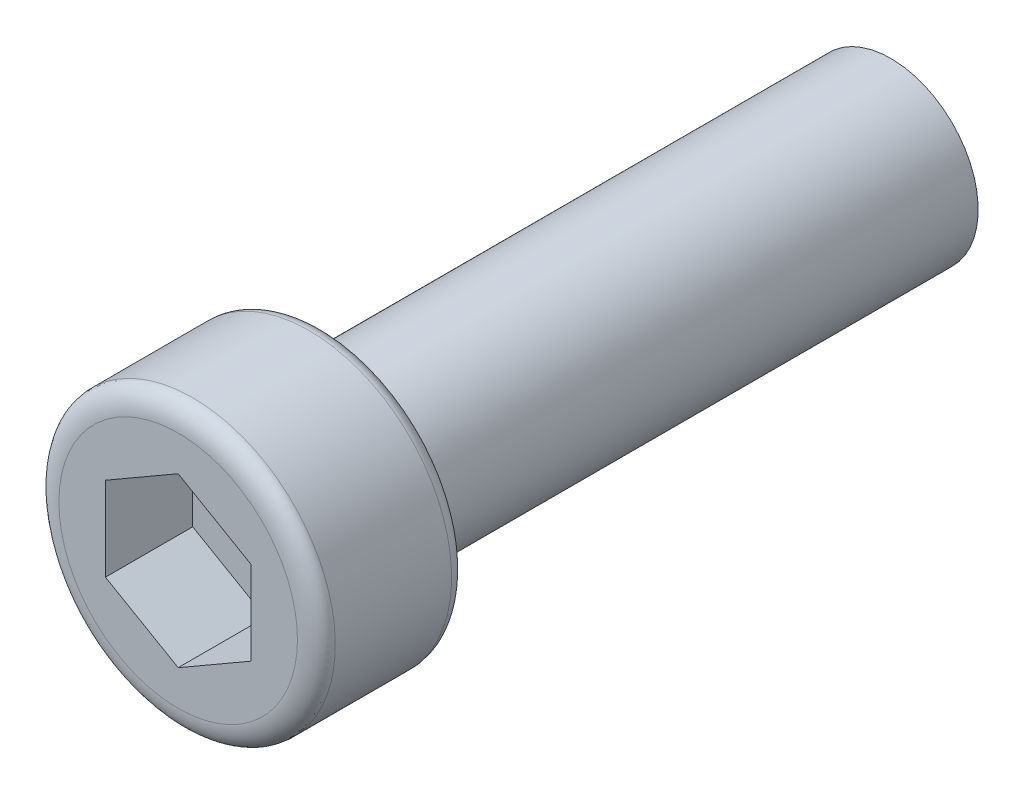
ISO-10303-21;
HEADER;
FILE_DESCRIPTION(('STEP AP214'),'2;1');
FILE_NAME('part.step','',(''),(''),'','','');
FILE_SCHEMA(('AUTOMOTIVE_DESIGN { 1 0 10303 214 1 1 1 1 }'));
ENDSEC;
DATA;
#1=APPLICATION_CONTEXT('core data for automotive mechanical design processes');
#2=APPLICATION_PROTOCOL_DEFINITION('international standard','automotive_design',2000,#1);
#3=PRODUCT_CONTEXT('',#1,'mechanical');
#4=PRODUCT('Part','Part','',(#3));
#5=PRODUCT_RELATED_PRODUCT_CATEGORY('part','',(#4));
#6=PRODUCT_DEFINITION_FORMATION('','',#4);
#7=PRODUCT_DEFINITION_CONTEXT('part definition',#1,'design');
#8=PRODUCT_DEFINITION('design','',#6,#7);
#9=PRODUCT_DEFINITION_SHAPE('','',#8);
#10=(LENGTH_UNIT() NAMED_UNIT(*) SI_UNIT(.MILLI.,.METRE.));
#11=(NAMED_UNIT(*) PLANE_ANGLE_UNIT() SI_UNIT($,.RADIAN.));
#12=(NAMED_UNIT(*) SI_UNIT($,.STERADIAN.) SOLID_ANGLE_UNIT());
#13=UNCERTAINTY_MEASURE_WITH_UNIT(LENGTH_MEASURE(1.E-05),#10,'distance_accuracy_value','');
#14=(GEOMETRIC_REPRESENTATION_CONTEXT(3) GLOBAL_UNCERTAINTY_ASSIGNED_CONTEXT((#13)) GLOBAL_UNIT_ASSIGNED_CONTEXT((#10,
#11,#12)) REPRESENTATION_CONTEXT('',''));
#15=CARTESIAN_POINT('',(0.,0.,0.));
#16=DIRECTION('',(0.,0.,1.));
#17=DIRECTION('',(1.,0.,0.));
#18=AXIS2_PLACEMENT_3D('',#15,#16,#17);
#19=CARTESIAN_POINT('',(0.,0.,12.5));
#20=DIRECTION('',(0.,0.,1.));
#21=DIRECTION('',(1.,0.,0.));
#22=AXIS2_PLACEMENT_3D('',#19,#20,#21);
#23=PLANE('',#22);
#24=DIRECTION('',(-0.866025403784439,0.5,0.));
#25=VECTOR('',#24,1.);
#26=CARTESIAN_POINT('',(2.5,1.44337567297407,12.5));
#27=LINE('',#26,#25);
#28=CARTESIAN_POINT('',(2.5,1.44337567297407,12.5));
#29=VERTEX_POINT('',#28);
#30=CARTESIAN_POINT('',(0.,2.88675134594813,12.5));
#31=VERTEX_POINT('',#30);
#32=EDGE_CURVE('E56',#29,#31,#27,.T.);
#33=ORIENTED_EDGE('',*,*,#32,.F.);
#34=DIRECTION('',(0.,1.,0.));
#35=VECTOR('',#34,1.);
#36=CARTESIAN_POINT('',(2.5,-1.44337567297407,12.5));
#37=LINE('',#36,#35);
#38=CARTESIAN_POINT('',(2.5,-1.44337567297407,12.5));
#39=VERTEX_POINT('',#38);
#40=EDGE_CURVE('E139',#39,#29,#37,.T.);
#41=ORIENTED_EDGE('',*,*,#40,.F.);
#42=DIRECTION('',(0.866025403784439,0.5,0.));
#43=VECTOR('',#42,1.);
#44=CARTESIAN_POINT('',(0.,-2.88675134594813,12.5));
#45=LINE('',#44,#43);
#46=CARTESIAN_POINT('',(0.,-2.88675134594813,12.5));
#47=VERTEX_POINT('',#46);
#48=EDGE_CURVE('E137',#47,#39,#45,.T.);
#49=ORIENTED_EDGE('',*,*,#48,.F.);
#50=DIRECTION('',(0.866025403784439,-0.5,0.));
#51=VECTOR('',#50,1.);
#52=CARTESIAN_POINT('',(-2.5,-1.44337567297406,12.5));
#53=LINE('',#52,#51);
#54=CARTESIAN_POINT('',(-2.5,-1.44337567297406,12.5));
#55=VERTEX_POINT('',#54);
#56=EDGE_CURVE('E104',#55,#47,#53,.T.);
#57=ORIENTED_EDGE('',*,*,#56,.F.);
#58=DIRECTION('',(0.,-1.,0.));
#59=VECTOR('',#58,1.);
#60=CARTESIAN_POINT('',(-2.5,1.44337567297407,12.5));
#61=LINE('',#60,#59);
#62=CARTESIAN_POINT('',(-2.5,1.44337567297407,12.5));
#63=VERTEX_POINT('',#62);
#64=EDGE_CURVE('E133',#63,#55,#61,.T.);
#65=ORIENTED_EDGE('',*,*,#64,.F.);
#66=DIRECTION('',(-0.866025403784439,-0.5,0.));
#67=VECTOR('',#66,1.);
#68=CARTESIAN_POINT('',(0.,2.88675134594813,12.5));
#69=LINE('',#68,#67);
#70=EDGE_CURVE('E130',#31,#63,#69,.T.);
#71=ORIENTED_EDGE('',*,*,#70,.F.);
#72=EDGE_LOOP('',(#33,#41,#49,#57,#65,#71));
#73=FACE_BOUND('',#72,.T.);
#74=CARTESIAN_POINT('',(-4.1,0.,12.5));
#75=CARTESIAN_POINT('',(-4.1,0.536688739667129,12.5));
#76=CARTESIAN_POINT('',(-3.99328797230372,1.07316633078914,12.5));
#77=CARTESIAN_POINT('',(-3.58252419428883,2.06483781460461,12.5));
#78=CARTESIAN_POINT('',(-3.27863405006997,2.51964155565972,12.5));
#79=CARTESIAN_POINT('',(-2.51964155565973,3.27863405006996,12.5));
#80=CARTESIAN_POINT('',(-2.06483781460462,3.58252419428867,12.5));
#81=CARTESIAN_POINT('',(-1.07316633078912,3.99328797230388,12.5));
#82=CARTESIAN_POINT('',(-0.536688739667131,4.1,12.5));
#83=CARTESIAN_POINT('',(0.536688739667131,4.1,12.5));
#84=CARTESIAN_POINT('',(1.07316633078912,3.99328797230376,12.5));
#85=CARTESIAN_POINT('',(2.06483781460462,3.58252419428879,12.5));
#86=CARTESIAN_POINT('',(2.51964155565984,3.27863405006985,12.5));
#87=CARTESIAN_POINT('',(3.27863405006985,2.51964155565984,12.5));
#88=CARTESIAN_POINT('',(3.58252419428868,2.06483781460462,12.5));
#89=CARTESIAN_POINT('',(3.99328797230388,1.07316633078912,12.5));
#90=CARTESIAN_POINT('',(4.1,0.536688739667154,12.5));
#91=CARTESIAN_POINT('',(4.1,-0.536688739667159,12.5));
#92=CARTESIAN_POINT('',(3.99328797230365,-1.07316633078958,12.5));
#93=CARTESIAN_POINT('',(3.58252419428891,-2.06483781460416,12.5));
#94=CARTESIAN_POINT('',(3.27863405007021,-2.51964155565937,12.5));
#95=CARTESIAN_POINT('',(2.51964155565949,-3.27863405007032,12.5));
#96=CARTESIAN_POINT('',(2.06483781460416,-3.58252419428891,12.5));
#97=CARTESIAN_POINT('',(1.07316633078958,-3.99328797230365,12.5));
#98=CARTESIAN_POINT('',(0.536688739667623,-4.10000000000001,12.5));
#99=CARTESIAN_POINT('',(-0.536688739667617,-4.10000000000001,12.5));
#100=CARTESIAN_POINT('',(-1.07316633078866,-3.993287972304,12.5));
#101=CARTESIAN_POINT('',(-2.06483781460509,-3.58252419428856,12.5));
#102=CARTESIAN_POINT('',(-2.51964155565972,-3.27863405006997,12.5));
#103=CARTESIAN_POINT('',(-3.27863405006997,-2.51964155565973,12.5));
#104=CARTESIAN_POINT('',(-3.58252419428884,-2.0648378146046,12.5));
#105=CARTESIAN_POINT('',(-3.99328797230372,-1.07316633078913,12.5));
#106=CARTESIAN_POINT('',(-4.1,-0.536688739667133,12.5));
#107=CARTESIAN_POINT('',(-4.1,0.,12.5));
#108=(BOUNDED_CURVE() B_SPLINE_CURVE(3,(#74,#75,#76,#77,#78,#79,#80,#81,#82,#83,#84,#85,#86,#87,
#88,#89,#90,#91,#92,#93,#94,#95,#96,#97,#98,#99,#100,#101,#102,#103,#104,#105,#106,#107),
.UNSPECIFIED.,.T.,.F.) B_SPLINE_CURVE_WITH_KNOTS((4,2,2,2,2,2,2,2,2,2,2,2,2,2,2,2,4),
(-3.14159265358979,-2.74889357189107,-2.35619449019234,-1.96349540849362,-1.5707963267949,
-1.17809724509617,-0.785398163397448,-0.392699081698724,0.,0.392699081698724,0.785398163397448,
1.17809724509617,1.5707963267949,1.96349540849362,2.35619449019234,2.74889357189107,
3.14159265358979),
.UNSPECIFIED.) CURVE() GEOMETRIC_REPRESENTATION_ITEM() RATIONAL_B_SPLINE_CURVE((1.,1.,1.,1.,1.,
1.,1.,1.,1.,1.,1.,1.,1.,1.,1.,1.,1.,1.,1.,1.,1.,1.,1.,1.,1.,1.,1.,1.,1.,1.,1.,1.,1.,1.)) REPRESENTATION_ITEM(''));
#109=CARTESIAN_POINT('',(-4.1,0.,12.5));
#110=VERTEX_POINT('',#109);
#111=EDGE_CURVE('E244',#110,#110,#108,.F.);
#112=ORIENTED_EDGE('',*,*,#111,.T.);
#113=EDGE_LOOP('',(#112));
#114=FACE_BOUND('',#113,.T.);
#115=ADVANCED_FACE('F41',(#73,#114),#23,.T.);
#116=CARTESIAN_POINT('',(0.,0.,-12.5));
#117=DIRECTION('',(0.,0.,-1.));
#118=DIRECTION('',(-1.,0.,0.));
#119=AXIS2_PLACEMENT_3D('',#116,#117,#118);
#120=CYLINDRICAL_SURFACE('',#119,4.9);
#121=CARTESIAN_POINT('',(-4.9,0.,12.));
#122=CARTESIAN_POINT('',(-4.9,-0.641408493748524,12.));
#123=CARTESIAN_POINT('',(-4.77246611324109,-1.28256463923584,12.));
#124=CARTESIAN_POINT('',(-4.28155330536953,-2.46773299794203,12.));
#125=CARTESIAN_POINT('',(-3.91836752325434,-3.01127893237383,12.));
#126=CARTESIAN_POINT('',(-3.01127893237383,-3.91836752325435,12.));
#127=CARTESIAN_POINT('',(-2.46773299794274,-4.28155330536923,12.));
#128=CARTESIAN_POINT('',(-1.28256463923515,-4.77246611324138,12.));
#129=CARTESIAN_POINT('',(-0.641408493749103,-4.90000000000001,12.));
#130=CARTESIAN_POINT('',(0.64140849374911,-4.9,12.));
#131=CARTESIAN_POINT('',(1.2825646392363,-4.7724661132409,12.));
#132=CARTESIAN_POINT('',(2.46773299794158,-4.28155330536972,12.));
#133=CARTESIAN_POINT('',(3.01127893237349,-3.91836752325469,12.));
#134=CARTESIAN_POINT('',(3.91836752325469,-3.01127893237349,12.));
#135=CARTESIAN_POINT('',(4.28155330536972,-2.46773299794158,12.));
#136=CARTESIAN_POINT('',(4.7724661132409,-1.2825646392363,12.));
#137=CARTESIAN_POINT('',(4.9,-0.641408493748555,12.));
#138=CARTESIAN_POINT('',(4.9,0.64140849374855,12.));
#139=CARTESIAN_POINT('',(4.77246611324114,1.28256463923572,12.));
#140=CARTESIAN_POINT('',(4.28155330536948,2.46773299794216,12.));
#141=CARTESIAN_POINT('',(3.91836752325422,3.01127893237395,12.));
#142=CARTESIAN_POINT('',(3.01127893237395,3.91836752325422,12.));
#143=CARTESIAN_POINT('',(2.46773299794202,4.28155330536953,12.));
#144=CARTESIAN_POINT('',(1.28256463923585,4.77246611324109,12.));
#145=CARTESIAN_POINT('',(0.641408493748522,4.9,12.));
#146=CARTESIAN_POINT('',(-0.641408493748522,4.9,12.));
#147=CARTESIAN_POINT('',(-1.28256463923573,4.77246611324114,12.));
#148=CARTESIAN_POINT('',(-2.46773299794216,4.28155330536947,12.));
#149=CARTESIAN_POINT('',(-3.01127893237383,3.91836752325434,12.));
#150=CARTESIAN_POINT('',(-3.91836752325434,3.01127893237382,12.));
#151=CARTESIAN_POINT('',(-4.28155330536952,2.46773299794204,12.));
#152=CARTESIAN_POINT('',(-4.77246611324109,1.28256463923585,12.));
#153=CARTESIAN_POINT('',(-4.9,0.64140849374852,12.));
#154=CARTESIAN_POINT('',(-4.9,0.,12.));
#155=(BOUNDED_CURVE() B_SPLINE_CURVE(3,(#121,#122,#123,#124,#125,#126,#127,#128,#129,#130,#131,
#132,#133,#134,#135,#136,#137,#138,#139,#140,#141,#142,#143,#144,#145,#146,#147,#148,#149,#150,
#151,#152,#153,#154),.UNSPECIFIED.,.T.,.F.) B_SPLINE_CURVE_WITH_KNOTS((4,2,2,2,2,2,2,2,2,2,2,2,
2,2,2,2,4),(-3.14159265358979,-2.74889357189107,-2.35619449019234,-1.96349540849362,
-1.5707963267949,-1.17809724509617,-0.785398163397448,-0.392699081698724,0.,0.392699081698724,
0.785398163397448,1.17809724509617,1.5707963267949,1.96349540849362,2.35619449019234,
2.74889357189107,3.14159265358979),
.UNSPECIFIED.) CURVE() GEOMETRIC_REPRESENTATION_ITEM() RATIONAL_B_SPLINE_CURVE((1.,1.,1.,1.,1.,
1.,1.,1.,1.,1.,1.,1.,1.,1.,1.,1.,1.,1.,1.,1.,1.,1.,1.,1.,1.,1.,1.,1.,1.,1.,1.,1.,1.,1.)) REPRESENTATION_ITEM(''));
#156=CARTESIAN_POINT('',(-4.9,0.,12.));
#157=VERTEX_POINT('',#156);
#158=EDGE_CURVE('E157',#157,#157,#155,.F.);
#159=ORIENTED_EDGE('',*,*,#158,.T.);
#160=EDGE_LOOP('',(#159));
#161=FACE_BOUND('',#160,.T.);
#162=CARTESIAN_POINT('',(0.,0.,8.));
#163=DIRECTION('',(0.,0.,-1.));
#164=DIRECTION('',(-1.,0.,0.));
#165=AXIS2_PLACEMENT_3D('',#162,#163,#164);
#166=CIRCLE('',#165,4.9);
#167=CARTESIAN_POINT('',(-4.9,0.,8.));
#168=VERTEX_POINT('',#167);
#169=EDGE_CURVE('E154',#168,#168,#166,.F.);
#170=ORIENTED_EDGE('',*,*,#169,.T.);
#171=EDGE_LOOP('',(#170));
#172=FACE_BOUND('',#171,.T.);
#173=ADVANCED_FACE('F168',(#161,#172),#120,.T.);
#174=CARTESIAN_POINT('',(0.,4.9,7.5));
#175=DIRECTION('',(0.,0.,-1.));
#176=DIRECTION('',(-1.,0.,0.));
#177=AXIS2_PLACEMENT_3D('',#174,#175,#176);
#178=PLANE('',#177);
#179=CARTESIAN_POINT('',(0.,0.,7.5));
#180=DIRECTION('',(0.,0.,-1.));
#181=DIRECTION('',(-1.,0.,0.));
#182=AXIS2_PLACEMENT_3D('',#179,#180,#181);
#183=CIRCLE('',#182,4.4);
#184=CARTESIAN_POINT('',(-4.4,0.,7.5));
#185=VERTEX_POINT('',#184);
#186=EDGE_CURVE('E151',#185,#185,#183,.T.);
#187=ORIENTED_EDGE('',*,*,#186,.T.);
#188=EDGE_LOOP('',(#187));
#189=FACE_BOUND('',#188,.T.);
#190=CARTESIAN_POINT('',(0.,0.,7.5));
#191=DIRECTION('',(0.,0.,-1.));
#192=DIRECTION('',(-1.,0.,0.));
#193=AXIS2_PLACEMENT_3D('',#190,#191,#192);
#194=CIRCLE('',#193,3.);
#195=CARTESIAN_POINT('',(-3.,0.,7.5));
#196=VERTEX_POINT('',#195);
#197=EDGE_CURVE('E143',#196,#196,#194,.T.);
#198=ORIENTED_EDGE('',*,*,#197,.F.);
#199=EDGE_LOOP('',(#198));
#200=FACE_BOUND('',#199,.T.);
#201=ADVANCED_FACE('F178',(#189,#200),#178,.T.);
#202=CARTESIAN_POINT('',(0.,0.,-12.5));
#203=DIRECTION('',(0.,0.,-1.));
#204=DIRECTION('',(-1.,0.,0.));
#205=AXIS2_PLACEMENT_3D('',#202,#203,#204);
#206=CYLINDRICAL_SURFACE('',#205,3.);
#207=CARTESIAN_POINT('',(0.,0.,-12.));
#208=DIRECTION('',(0.,0.,-1.));
#209=DIRECTION('',(-1.,0.,0.));
#210=AXIS2_PLACEMENT_3D('',#207,#208,#209);
#211=CIRCLE('',#210,3.);
#212=CARTESIAN_POINT('',(-3.,0.,-12.));
#213=VERTEX_POINT('',#212);
#214=EDGE_CURVE('E12',#213,#213,#211,.F.);
#215=ORIENTED_EDGE('',*,*,#214,.T.);
#216=EDGE_LOOP('',(#215));
#217=FACE_BOUND('',#216,.T.);
#218=ORIENTED_EDGE('',*,*,#197,.T.);
#219=EDGE_LOOP('',(#218));
#220=FACE_BOUND('',#219,.T.);
#221=ADVANCED_FACE('F260',(#217,#220),#206,.T.);
#222=CARTESIAN_POINT('',(0.,3.,-12.5));
#223=DIRECTION('',(0.,0.,-1.));
#224=DIRECTION('',(-1.,0.,0.));
#225=AXIS2_PLACEMENT_3D('',#222,#223,#224);
#226=PLANE('',#225);
#227=CARTESIAN_POINT('',(0.,0.,-12.5));
#228=DIRECTION('',(0.,0.,-1.));
#229=DIRECTION('',(-1.,0.,0.));
#230=AXIS2_PLACEMENT_3D('',#227,#228,#229);
#231=CIRCLE('',#230,2.13397459621556);
#232=CARTESIAN_POINT('',(-2.13397459621556,0.,-12.5));
#233=VERTEX_POINT('',#232);
#234=EDGE_CURVE('E49',#233,#233,#231,.T.);
#235=ORIENTED_EDGE('',*,*,#234,.T.);
#236=EDGE_LOOP('',(#235));
#237=FACE_BOUND('',#236,.T.);
#238=ADVANCED_FACE('F248',(#237),#226,.T.);
#239=CARTESIAN_POINT('',(0.,0.,8.));
#240=DIRECTION('',(0.,0.,-1.));
#241=DIRECTION('',(-1.,0.,0.));
#242=AXIS2_PLACEMENT_3D('',#239,#240,#241);
#243=TOROIDAL_SURFACE('',#242,4.4,0.5);
#244=ORIENTED_EDGE('',*,*,#169,.F.);
#245=EDGE_LOOP('',(#244));
#246=FACE_BOUND('',#245,.T.);
#247=ORIENTED_EDGE('',*,*,#186,.F.);
#248=EDGE_LOOP('',(#247));
#249=FACE_BOUND('',#248,.T.);
#250=ADVANCED_FACE('F184',(#246,#249),#243,.T.);
#251=CARTESIAN_POINT('',(-4.1,0.,12.5));
#252=CARTESIAN_POINT('',(-4.1,-0.536688739667133,12.5));
#253=CARTESIAN_POINT('',(-3.99328797230372,-1.07316633078913,12.5));
#254=CARTESIAN_POINT('',(-3.58252419428884,-2.0648378146046,12.5));
#255=CARTESIAN_POINT('',(-3.27863405006997,-2.51964155565973,12.5));
#256=CARTESIAN_POINT('',(-2.51964155565972,-3.27863405006997,12.5));
#257=CARTESIAN_POINT('',(-2.06483781460509,-3.58252419428856,12.5));
#258=CARTESIAN_POINT('',(-1.07316633078866,-3.993287972304,12.5));
#259=CARTESIAN_POINT('',(-0.536688739667617,-4.10000000000001,12.5));
#260=CARTESIAN_POINT('',(0.536688739667623,-4.10000000000001,12.5));
#261=CARTESIAN_POINT('',(1.07316633078958,-3.99328797230365,12.5));
#262=CARTESIAN_POINT('',(2.06483781460416,-3.58252419428891,12.5));
#263=CARTESIAN_POINT('',(2.51964155565949,-3.27863405007032,12.5));
#264=CARTESIAN_POINT('',(3.27863405007021,-2.51964155565937,12.5));
#265=CARTESIAN_POINT('',(3.58252419428891,-2.06483781460416,12.5));
#266=CARTESIAN_POINT('',(3.99328797230365,-1.07316633078958,12.5));
#267=CARTESIAN_POINT('',(4.1,-0.536688739667159,12.5));
#268=CARTESIAN_POINT('',(4.1,0.536688739667154,12.5));
#269=CARTESIAN_POINT('',(3.99328797230388,1.07316633078912,12.5));
#270=CARTESIAN_POINT('',(3.58252419428868,2.06483781460462,12.5));
#271=CARTESIAN_POINT('',(3.27863405006985,2.51964155565984,12.5));
#272=CARTESIAN_POINT('',(2.51964155565984,3.27863405006985,12.5));
#273=CARTESIAN_POINT('',(2.06483781460462,3.58252419428879,12.5));
#274=CARTESIAN_POINT('',(1.07316633078912,3.99328797230376,12.5));
#275=CARTESIAN_POINT('',(0.536688739667131,4.1,12.5));
#276=CARTESIAN_POINT('',(-0.536688739667131,4.1,12.5));
#277=CARTESIAN_POINT('',(-1.07316633078912,3.99328797230388,12.5));
#278=CARTESIAN_POINT('',(-2.06483781460462,3.58252419428867,12.5));
#279=CARTESIAN_POINT('',(-2.51964155565973,3.27863405006996,12.5));
#280=CARTESIAN_POINT('',(-3.27863405006997,2.51964155565972,12.5));
#281=CARTESIAN_POINT('',(-3.58252419428883,2.06483781460461,12.5));
#282=CARTESIAN_POINT('',(-3.99328797230372,1.07316633078914,12.5));
#283=CARTESIAN_POINT('',(-4.1,0.536688739667129,12.5));
#284=CARTESIAN_POINT('',(-4.1,0.,12.5));
#285=CARTESIAN_POINT('',(-4.9,0.,12.5));
#286=CARTESIAN_POINT('',(-4.9,-0.641408493748524,12.5));
#287=CARTESIAN_POINT('',(-4.77246611324099,-1.28256463923586,12.5));
#288=CARTESIAN_POINT('',(-4.28155330536963,-2.46773299794202,12.5));
#289=CARTESIAN_POINT('',(-3.91836752325405,-3.01127893237389,12.5));
#290=CARTESIAN_POINT('',(-3.01127893237412,-3.91836752325429,12.5));
#291=CARTESIAN_POINT('',(-2.46773299794271,-4.28155330536916,12.5));
#292=CARTESIAN_POINT('',(-1.28256463923518,-4.77246611324146,12.5));
#293=CARTESIAN_POINT('',(-0.641408493749103,-4.90000000000001,12.5));
#294=CARTESIAN_POINT('',(0.64140849374911,-4.90000000000001,12.5));
#295=CARTESIAN_POINT('',(1.2825646392364,-4.772466113241,12.5));
#296=CARTESIAN_POINT('',(2.46773299794148,-4.28155330536962,12.5));
#297=CARTESIAN_POINT('',(3.01127893237349,-3.91836752325492,12.5));
#298=CARTESIAN_POINT('',(3.91836752325469,-3.01127893237325,12.5));
#299=CARTESIAN_POINT('',(4.28155330536962,-2.46773299794166,12.5));
#300=CARTESIAN_POINT('',(4.772466113241,-1.28256463923623,12.5));
#301=CARTESIAN_POINT('',(4.9,-0.641408493748556,12.5));
#302=CARTESIAN_POINT('',(4.9,0.641408493748551,12.5));
#303=CARTESIAN_POINT('',(4.77246611324123,1.2825646392357,12.5));
#304=CARTESIAN_POINT('',(4.28155330536939,2.46773299794218,12.5));
#305=CARTESIAN_POINT('',(3.91836752325445,3.01127893237395,12.5));
#306=CARTESIAN_POINT('',(3.01127893237372,3.91836752325422,12.5));
#307=CARTESIAN_POINT('',(2.46773299794206,4.28155330536962,12.5));
#308=CARTESIAN_POINT('',(1.28256463923582,4.77246611324099,12.5));
#309=CARTESIAN_POINT('',(0.641408493748523,4.9,12.5));
#310=CARTESIAN_POINT('',(-0.641408493748522,4.9,12.5));
#311=CARTESIAN_POINT('',(-1.28256463923588,4.77246611324122,12.5));
#312=CARTESIAN_POINT('',(-2.46773299794201,4.28155330536939,12.5));
#313=CARTESIAN_POINT('',(-3.01127893237366,3.91836752325428,12.5));
#314=CARTESIAN_POINT('',(-3.91836752325452,3.01127893237388,12.5));
#315=CARTESIAN_POINT('',(-4.28155330536963,2.46773299794214,12.5));
#316=CARTESIAN_POINT('',(-4.77246611324098,1.28256463923575,12.5));
#317=CARTESIAN_POINT('',(-4.9,0.641408493748521,12.5));
#318=CARTESIAN_POINT('',(-4.9,0.,12.5));
#319=CARTESIAN_POINT('',(-4.9,0.,12.));
#320=CARTESIAN_POINT('',(-4.9,-0.641408493748524,12.));
#321=CARTESIAN_POINT('',(-4.77246611324109,-1.28256463923584,12.));
#322=CARTESIAN_POINT('',(-4.28155330536953,-2.46773299794203,12.));
#323=CARTESIAN_POINT('',(-3.91836752325434,-3.01127893237383,12.));
#324=CARTESIAN_POINT('',(-3.01127893237383,-3.91836752325435,12.));
#325=CARTESIAN_POINT('',(-2.46773299794274,-4.28155330536923,12.));
#326=CARTESIAN_POINT('',(-1.28256463923515,-4.77246611324138,12.));
#327=CARTESIAN_POINT('',(-0.641408493749103,-4.90000000000001,12.));
#328=CARTESIAN_POINT('',(0.64140849374911,-4.9,12.));
#329=CARTESIAN_POINT('',(1.2825646392363,-4.7724661132409,12.));
#330=CARTESIAN_POINT('',(2.46773299794158,-4.28155330536972,12.));
#331=CARTESIAN_POINT('',(3.01127893237349,-3.91836752325469,12.));
#332=CARTESIAN_POINT('',(3.91836752325469,-3.01127893237349,12.));
#333=CARTESIAN_POINT('',(4.28155330536972,-2.46773299794158,12.));
#334=CARTESIAN_POINT('',(4.7724661132409,-1.2825646392363,12.));
#335=CARTESIAN_POINT('',(4.9,-0.641408493748555,12.));
#336=CARTESIAN_POINT('',(4.9,0.64140849374855,12.));
#337=CARTESIAN_POINT('',(4.77246611324114,1.28256463923572,12.));
#338=CARTESIAN_POINT('',(4.28155330536948,2.46773299794216,12.));
#339=CARTESIAN_POINT('',(3.91836752325422,3.01127893237395,12.));
#340=CARTESIAN_POINT('',(3.01127893237395,3.91836752325422,12.));
#341=CARTESIAN_POINT('',(2.46773299794202,4.28155330536953,12.));
#342=CARTESIAN_POINT('',(1.28256463923585,4.77246611324109,12.));
#343=CARTESIAN_POINT('',(0.641408493748522,4.9,12.));
#344=CARTESIAN_POINT('',(-0.641408493748522,4.9,12.));
#345=CARTESIAN_POINT('',(-1.28256463923573,4.77246611324114,12.));
#346=CARTESIAN_POINT('',(-2.46773299794216,4.28155330536947,12.));
#347=CARTESIAN_POINT('',(-3.01127893237383,3.91836752325434,12.));
#348=CARTESIAN_POINT('',(-3.91836752325434,3.01127893237382,12.));
#349=CARTESIAN_POINT('',(-4.28155330536952,2.46773299794204,12.));
#350=CARTESIAN_POINT('',(-4.77246611324109,1.28256463923585,12.));
#351=CARTESIAN_POINT('',(-4.9,0.64140849374852,12.));
#352=CARTESIAN_POINT('',(-4.9,0.,12.));
#353=(BOUNDED_SURFACE() B_SPLINE_SURFACE(2,3,((#251,#252,#253,#254,#255,#256,#257,#258,#259,
#260,#261,#262,#263,#264,#265,#266,#267,#268,#269,#270,#271,#272,#273,#274,#275,#276,#277,#278,
#279,#280,#281,#282,#283,#284),(#285,#286,#287,#288,#289,#290,#291,#292,#293,#294,#295,#296,
#297,#298,#299,#300,#301,#302,#303,#304,#305,#306,#307,#308,#309,#310,#311,#312,#313,#314,#315,
#316,#317,#318),(#319,#320,#321,#322,#323,#324,#325,#326,#327,#328,#329,#330,#331,#332,#333,
#334,#335,#336,#337,#338,#339,#340,#341,#342,#343,#344,#345,#346,#347,#348,#349,#350,#351,
#352)),.UNSPECIFIED.,.F.,.T.,.F.) B_SPLINE_SURFACE_WITH_KNOTS((3,3),(4,2,2,2,2,2,2,2,2,2,2,2,2,
2,2,2,4),(0.,1.),(-3.14159265358979,-2.74889357189107,-2.35619449019234,-1.96349540849362,
-1.5707963267949,-1.17809724509617,-0.785398163397448,-0.392699081698724,0.,0.392699081698724,
0.785398163397448,1.17809724509617,1.5707963267949,1.96349540849362,2.35619449019234,
2.74889357189107,3.14159265358979),
.UNSPECIFIED.) GEOMETRIC_REPRESENTATION_ITEM() RATIONAL_B_SPLINE_SURFACE(((1.,1.,1.,1.,1.,1.,1.,
1.,1.,1.,1.,1.,1.,1.,1.,1.,1.,1.,1.,1.,1.,1.,1.,1.,1.,1.,1.,1.,1.,1.,1.,1.,1.,1.),
(0.707106781186547,0.707106781186547,0.707106781186547,0.707106781186547,0.707106781186547,
0.707106781186547,0.707106781186547,0.707106781186547,0.707106781186547,0.707106781186547,
0.707106781186547,0.707106781186547,0.707106781186547,0.707106781186547,0.707106781186547,
0.707106781186547,0.707106781186547,0.707106781186547,0.707106781186547,0.707106781186547,
0.707106781186547,0.707106781186547,0.707106781186547,0.707106781186547,0.707106781186547,
0.707106781186547,0.707106781186547,0.707106781186547,0.707106781186547,0.707106781186547,
0.707106781186547,0.707106781186547,0.707106781186547,0.707106781186547),(1.,1.,1.,1.,1.,1.,1.,
1.,1.,1.,1.,1.,1.,1.,1.,1.,1.,1.,1.,1.,1.,1.,1.,1.,1.,1.,1.,1.,1.,1.,1.,1.,1.,1.))) REPRESENTATION_ITEM('') SURFACE());
#354=ORIENTED_EDGE('',*,*,#111,.F.);
#355=EDGE_LOOP('',(#354));
#356=FACE_BOUND('',#355,.T.);
#357=ORIENTED_EDGE('',*,*,#158,.F.);
#358=EDGE_LOOP('',(#357));
#359=FACE_BOUND('',#358,.T.);
#360=ADVANCED_FACE('F201',(#356,#359),#353,.T.);
#361=CARTESIAN_POINT('',(0.,0.,-12.5));
#362=DIRECTION('',(0.,0.,1.));
#363=DIRECTION('',(1.,0.,0.));
#364=AXIS2_PLACEMENT_3D('',#361,#362,#363);
#365=CONICAL_SURFACE('',#364,2.13397459621556,1.0471975511966);
#366=ORIENTED_EDGE('',*,*,#214,.F.);
#367=EDGE_LOOP('',(#366));
#368=FACE_BOUND('',#367,.T.);
#369=ORIENTED_EDGE('',*,*,#234,.F.);
#370=EDGE_LOOP('',(#369));
#371=FACE_BOUND('',#370,.T.);
#372=ADVANCED_FACE('F44',(#368,#371),#365,.T.);
#373=CARTESIAN_POINT('',(2.5,1.44337567297407,9.5));
#374=DIRECTION('',(0.5,0.866025403784438,0.));
#375=DIRECTION('',(-0.866025403784439,0.5,0.));
#376=AXIS2_PLACEMENT_3D('',#373,#374,#375);
#377=PLANE('',#376);
#378=ORIENTED_EDGE('',*,*,#32,.T.);
#379=DIRECTION('',(0.,0.,1.));
#380=VECTOR('',#379,1.);
#381=CARTESIAN_POINT('',(0.,2.88675134594813,9.5));
#382=LINE('',#381,#380);
#383=CARTESIAN_POINT('',(0.,2.88675134594813,9.5));
#384=VERTEX_POINT('',#383);
#385=EDGE_CURVE('E86',#384,#31,#382,.T.);
#386=ORIENTED_EDGE('',*,*,#385,.F.);
#387=DIRECTION('',(-0.866025403784439,0.5,0.));
#388=VECTOR('',#387,1.);
#389=CARTESIAN_POINT('',(2.5,1.44337567297407,9.5));
#390=LINE('',#389,#388);
#391=CARTESIAN_POINT('',(2.5,1.44337567297407,9.5));
#392=VERTEX_POINT('',#391);
#393=EDGE_CURVE('E141',#392,#384,#390,.T.);
#394=ORIENTED_EDGE('',*,*,#393,.F.);
#395=DIRECTION('',(0.,0.,1.));
#396=VECTOR('',#395,1.);
#397=CARTESIAN_POINT('',(2.5,1.44337567297407,9.5));
#398=LINE('',#397,#396);
#399=EDGE_CURVE('E64',#392,#29,#398,.T.);
#400=ORIENTED_EDGE('',*,*,#399,.T.);
#401=EDGE_LOOP('',(#378,#386,#394,#400));
#402=FACE_BOUND('',#401,.T.);
#403=ADVANCED_FACE('F251',(#402),#377,.F.);
#404=CARTESIAN_POINT('',(2.5,-1.44337567297407,9.5));
#405=DIRECTION('',(1.,0.,0.));
#406=DIRECTION('',(0.,1.,0.));
#407=AXIS2_PLACEMENT_3D('',#404,#405,#406);
#408=PLANE('',#407);
#409=ORIENTED_EDGE('',*,*,#40,.T.);
#410=ORIENTED_EDGE('',*,*,#399,.F.);
#411=DIRECTION('',(0.,1.,0.));
#412=VECTOR('',#411,1.);
#413=CARTESIAN_POINT('',(2.5,-1.44337567297407,9.5));
#414=LINE('',#413,#412);
#415=CARTESIAN_POINT('',(2.5,-1.44337567297407,9.5));
#416=VERTEX_POINT('',#415);
#417=EDGE_CURVE('E116',#416,#392,#414,.T.);
#418=ORIENTED_EDGE('',*,*,#417,.F.);
#419=DIRECTION('',(0.,0.,1.));
#420=VECTOR('',#419,1.);
#421=CARTESIAN_POINT('',(2.5,-1.44337567297407,9.5));
#422=LINE('',#421,#420);
#423=EDGE_CURVE('E108',#416,#39,#422,.T.);
#424=ORIENTED_EDGE('',*,*,#423,.T.);
#425=EDGE_LOOP('',(#409,#410,#418,#424));
#426=FACE_BOUND('',#425,.T.);
#427=ADVANCED_FACE('F256',(#426),#408,.F.);
#428=CARTESIAN_POINT('',(0.,-2.88675134594813,9.5));
#429=DIRECTION('',(0.5,-0.866025403784439,0.));
#430=DIRECTION('',(0.866025403784439,0.5,0.));
#431=AXIS2_PLACEMENT_3D('',#428,#429,#430);
#432=PLANE('',#431);
#433=ORIENTED_EDGE('',*,*,#48,.T.);
#434=ORIENTED_EDGE('',*,*,#423,.F.);
#435=DIRECTION('',(0.866025403784439,0.5,0.));
#436=VECTOR('',#435,1.);
#437=CARTESIAN_POINT('',(0.,-2.88675134594813,9.5));
#438=LINE('',#437,#436);
#439=CARTESIAN_POINT('',(0.,-2.88675134594813,9.5));
#440=VERTEX_POINT('',#439);
#441=EDGE_CURVE('E112',#440,#416,#438,.T.);
#442=ORIENTED_EDGE('',*,*,#441,.F.);
#443=DIRECTION('',(0.,0.,1.));
#444=VECTOR('',#443,1.);
#445=CARTESIAN_POINT('',(0.,-2.88675134594813,9.5));
#446=LINE('',#445,#444);
#447=EDGE_CURVE('E97',#440,#47,#446,.T.);
#448=ORIENTED_EDGE('',*,*,#447,.T.);
#449=EDGE_LOOP('',(#433,#434,#442,#448));
#450=FACE_BOUND('',#449,.T.);
#451=ADVANCED_FACE('F113',(#450),#432,.F.);
#452=CARTESIAN_POINT('',(-2.5,-1.44337567297406,9.5));
#453=DIRECTION('',(-0.5,-0.866025403784438,0.));
#454=DIRECTION('',(0.866025403784439,-0.5,0.));
#455=AXIS2_PLACEMENT_3D('',#452,#453,#454);
#456=PLANE('',#455);
#457=ORIENTED_EDGE('',*,*,#56,.T.);
#458=ORIENTED_EDGE('',*,*,#447,.F.);
#459=DIRECTION('',(0.866025403784439,-0.5,0.));
#460=VECTOR('',#459,1.);
#461=CARTESIAN_POINT('',(-2.5,-1.44337567297406,9.5));
#462=LINE('',#461,#460);
#463=CARTESIAN_POINT('',(-2.5,-1.44337567297406,9.5));
#464=VERTEX_POINT('',#463);
#465=EDGE_CURVE('E101',#464,#440,#462,.T.);
#466=ORIENTED_EDGE('',*,*,#465,.F.);
#467=DIRECTION('',(0.,0.,1.));
#468=VECTOR('',#467,1.);
#469=CARTESIAN_POINT('',(-2.5,-1.44337567297406,9.5));
#470=LINE('',#469,#468);
#471=EDGE_CURVE('E109',#464,#55,#470,.T.);
#472=ORIENTED_EDGE('',*,*,#471,.T.);
#473=EDGE_LOOP('',(#457,#458,#466,#472));
#474=FACE_BOUND('',#473,.T.);
#475=ADVANCED_FACE('F99',(#474),#456,.F.);
#476=CARTESIAN_POINT('',(-2.5,1.44337567297407,9.5));
#477=DIRECTION('',(-1.,0.,0.));
#478=DIRECTION('',(0.,0.,1.));
#479=AXIS2_PLACEMENT_3D('',#476,#477,#478);
#480=PLANE('',#479);
#481=ORIENTED_EDGE('',*,*,#64,.T.);
#482=ORIENTED_EDGE('',*,*,#471,.F.);
#483=DIRECTION('',(0.,-1.,0.));
#484=VECTOR('',#483,1.);
#485=CARTESIAN_POINT('',(-2.5,1.44337567297407,9.5));
#486=LINE('',#485,#484);
#487=CARTESIAN_POINT('',(-2.5,1.44337567297407,9.5));
#488=VERTEX_POINT('',#487);
#489=EDGE_CURVE('E122',#488,#464,#486,.T.);
#490=ORIENTED_EDGE('',*,*,#489,.F.);
#491=DIRECTION('',(0.,0.,1.));
#492=VECTOR('',#491,1.);
#493=CARTESIAN_POINT('',(-2.5,1.44337567297407,9.5));
#494=LINE('',#493,#492);
#495=EDGE_CURVE('E146',#488,#63,#494,.T.);
#496=ORIENTED_EDGE('',*,*,#495,.T.);
#497=EDGE_LOOP('',(#481,#482,#490,#496));
#498=FACE_BOUND('',#497,.T.);
#499=ADVANCED_FACE('F285',(#498),#480,.F.);
#500=CARTESIAN_POINT('',(0.,2.88675134594813,9.5));
#501=DIRECTION('',(-0.5,0.866025403784439,0.));
#502=DIRECTION('',(-0.866025403784439,-0.5,0.));
#503=AXIS2_PLACEMENT_3D('',#500,#501,#502);
#504=PLANE('',#503);
#505=ORIENTED_EDGE('',*,*,#70,.T.);
#506=ORIENTED_EDGE('',*,*,#495,.F.);
#507=DIRECTION('',(-0.866025403784439,-0.5,0.));
#508=VECTOR('',#507,1.);
#509=CARTESIAN_POINT('',(0.,2.88675134594813,9.5));
#510=LINE('',#509,#508);
#511=EDGE_CURVE('E124',#384,#488,#510,.T.);
#512=ORIENTED_EDGE('',*,*,#511,.F.);
#513=ORIENTED_EDGE('',*,*,#385,.T.);
#514=EDGE_LOOP('',(#505,#506,#512,#513));
#515=FACE_BOUND('',#514,.T.);
#516=ADVANCED_FACE('F282',(#515),#504,.F.);
#517=CARTESIAN_POINT('',(0.,0.,9.5));
#518=DIRECTION('',(0.,0.,1.));
#519=DIRECTION('',(1.,0.,0.));
#520=AXIS2_PLACEMENT_3D('',#517,#518,#519);
#521=PLANE('',#520);
#522=ORIENTED_EDGE('',*,*,#393,.T.);
#523=ORIENTED_EDGE('',*,*,#511,.T.);
#524=ORIENTED_EDGE('',*,*,#489,.T.);
#525=ORIENTED_EDGE('',*,*,#465,.T.);
#526=ORIENTED_EDGE('',*,*,#441,.T.);
#527=ORIENTED_EDGE('',*,*,#417,.T.);
#528=EDGE_LOOP('',(#522,#523,#524,#525,#526,#527));
#529=FACE_BOUND('',#528,.T.);
#530=ADVANCED_FACE('F119',(#529),#521,.T.);
#531=CLOSED_SHELL('',(#115,#173,#201,#221,#238,#250,#360,#372,#403,#427,#451,#475,#499,#516,#530));
#532=MANIFOLD_SOLID_BREP('B2',#531);
#533=ADVANCED_BREP_SHAPE_REPRESENTATION('',(#18,#532),#14);
#534=SHAPE_DEFINITION_REPRESENTATION(#9,#533);
ENDSEC;
END-ISO-10303-21;
